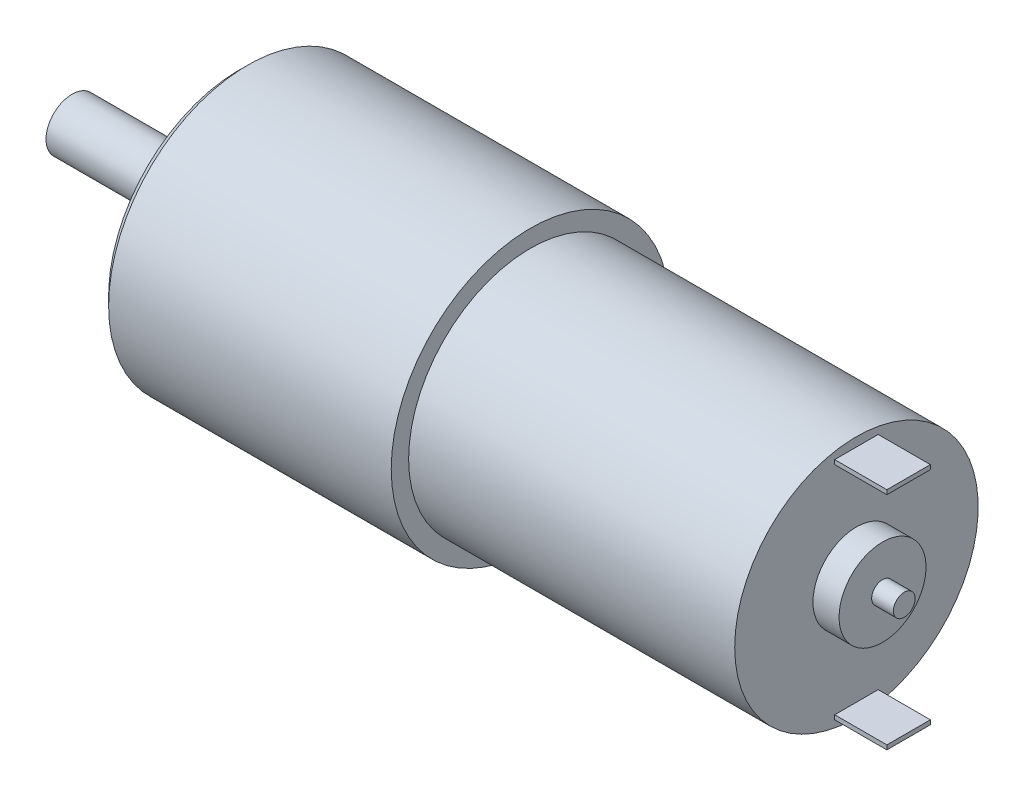
ISO-10303-21;
HEADER;
FILE_DESCRIPTION(('STEP AP214'),'2;1');
FILE_NAME('part.step','',(''),(''),'','','');
FILE_SCHEMA(('AUTOMOTIVE_DESIGN { 1 0 10303 214 1 1 1 1 }'));
ENDSEC;
DATA;
#1=APPLICATION_CONTEXT('core data for automotive mechanical design processes');
#2=APPLICATION_PROTOCOL_DEFINITION('international standard','automotive_design',2000,#1);
#3=PRODUCT_CONTEXT('',#1,'mechanical');
#4=PRODUCT('Part','Part','',(#3));
#5=PRODUCT_RELATED_PRODUCT_CATEGORY('part','',(#4));
#6=PRODUCT_DEFINITION_FORMATION('','',#4);
#7=PRODUCT_DEFINITION_CONTEXT('part definition',#1,'design');
#8=PRODUCT_DEFINITION('design','',#6,#7);
#9=PRODUCT_DEFINITION_SHAPE('','',#8);
#10=(LENGTH_UNIT() NAMED_UNIT(*) SI_UNIT(.MILLI.,.METRE.));
#11=(NAMED_UNIT(*) PLANE_ANGLE_UNIT() SI_UNIT($,.RADIAN.));
#12=(NAMED_UNIT(*) SI_UNIT($,.STERADIAN.) SOLID_ANGLE_UNIT());
#13=UNCERTAINTY_MEASURE_WITH_UNIT(LENGTH_MEASURE(1.E-05),#10,'distance_accuracy_value','');
#14=(GEOMETRIC_REPRESENTATION_CONTEXT(3) GLOBAL_UNCERTAINTY_ASSIGNED_CONTEXT((#13)) GLOBAL_UNIT_ASSIGNED_CONTEXT((#10,
#11,#12)) REPRESENTATION_CONTEXT('',''));
#15=CARTESIAN_POINT('',(0.,0.,0.));
#16=DIRECTION('',(0.,0.,1.));
#17=DIRECTION('',(1.,0.,0.));
#18=AXIS2_PLACEMENT_3D('',#15,#16,#17);
#19=CARTESIAN_POINT('',(90.2,0.,-14.));
#20=DIRECTION('',(-1.,0.,0.));
#21=DIRECTION('',(0.,0.,1.));
#22=AXIS2_PLACEMENT_3D('',#19,#20,#21);
#23=PLANE('',#22);
#24=DIRECTION('',(0.,-1.,0.));
#25=VECTOR('',#24,1.);
#26=CARTESIAN_POINT('',(90.2,12.4569736347008,2.5));
#27=LINE('',#26,#25);
#28=CARTESIAN_POINT('',(90.2,12.9569736347008,2.5));
#29=VERTEX_POINT('',#28);
#30=CARTESIAN_POINT('',(90.2,12.4569736347008,2.5));
#31=VERTEX_POINT('',#30);
#32=EDGE_CURVE('E146',#29,#31,#27,.T.);
#33=ORIENTED_EDGE('',*,*,#32,.F.);
#34=DIRECTION('',(0.,0.,1.));
#35=VECTOR('',#34,1.);
#36=CARTESIAN_POINT('',(90.2,12.9569736347008,0.));
#37=LINE('',#36,#35);
#38=CARTESIAN_POINT('',(90.2,12.9569736347008,-2.5));
#39=VERTEX_POINT('',#38);
#40=EDGE_CURVE('E159',#39,#29,#37,.T.);
#41=ORIENTED_EDGE('',*,*,#40,.F.);
#42=DIRECTION('',(0.,1.,0.));
#43=VECTOR('',#42,1.);
#44=CARTESIAN_POINT('',(90.2,12.9569736347008,-2.5));
#45=LINE('',#44,#43);
#46=CARTESIAN_POINT('',(90.2,12.4569736347008,-2.5));
#47=VERTEX_POINT('',#46);
#48=EDGE_CURVE('E169',#47,#39,#45,.T.);
#49=ORIENTED_EDGE('',*,*,#48,.F.);
#50=DIRECTION('',(0.,0.,-1.));
#51=VECTOR('',#50,1.);
#52=CARTESIAN_POINT('',(90.2,12.4569736347008,2.5));
#53=LINE('',#52,#51);
#54=EDGE_CURVE('E149',#31,#47,#53,.T.);
#55=ORIENTED_EDGE('',*,*,#54,.F.);
#56=EDGE_LOOP('',(#33,#41,#49,#55));
#57=FACE_BOUND('',#56,.T.);
#58=CARTESIAN_POINT('',(90.2,0.,0.));
#59=DIRECTION('',(-1.,0.,0.));
#60=DIRECTION('',(0.,0.,1.));
#61=AXIS2_PLACEMENT_3D('',#58,#59,#60);
#62=CIRCLE('',#61,14.);
#63=CARTESIAN_POINT('',(90.2,0.,14.));
#64=VERTEX_POINT('',#63);
#65=EDGE_CURVE('E242',#64,#64,#62,.T.);
#66=ORIENTED_EDGE('',*,*,#65,.F.);
#67=EDGE_LOOP('',(#66));
#68=FACE_BOUND('',#67,.T.);
#69=CARTESIAN_POINT('',(90.2,0.,0.));
#70=DIRECTION('',(-1.,0.,0.));
#71=DIRECTION('',(0.,0.,1.));
#72=AXIS2_PLACEMENT_3D('',#69,#70,#71);
#73=CIRCLE('',#72,5.);
#74=CARTESIAN_POINT('',(90.2,0.,5.));
#75=VERTEX_POINT('',#74);
#76=EDGE_CURVE('E239',#75,#75,#73,.T.);
#77=ORIENTED_EDGE('',*,*,#76,.T.);
#78=EDGE_LOOP('',(#77));
#79=FACE_BOUND('',#78,.T.);
#80=DIRECTION('',(0.,1.,0.));
#81=VECTOR('',#80,1.);
#82=CARTESIAN_POINT('',(90.2,-12.4569736347008,-2.5));
#83=LINE('',#82,#81);
#84=CARTESIAN_POINT('',(90.2,-12.9569736347008,-2.5));
#85=VERTEX_POINT('',#84);
#86=CARTESIAN_POINT('',(90.2,-12.4569736347008,-2.5));
#87=VERTEX_POINT('',#86);
#88=EDGE_CURVE('E408',#85,#87,#83,.T.);
#89=ORIENTED_EDGE('',*,*,#88,.F.);
#90=DIRECTION('',(0.,0.,-1.));
#91=VECTOR('',#90,1.);
#92=CARTESIAN_POINT('',(90.2,-12.9569736347008,0.));
#93=LINE('',#92,#91);
#94=CARTESIAN_POINT('',(90.2,-12.9569736347008,2.5));
#95=VERTEX_POINT('',#94);
#96=EDGE_CURVE('E142',#95,#85,#93,.T.);
#97=ORIENTED_EDGE('',*,*,#96,.F.);
#98=DIRECTION('',(0.,-1.,0.));
#99=VECTOR('',#98,1.);
#100=CARTESIAN_POINT('',(90.2,-12.9569736347008,2.5));
#101=LINE('',#100,#99);
#102=CARTESIAN_POINT('',(90.2,-12.4569736347008,2.5));
#103=VERTEX_POINT('',#102);
#104=EDGE_CURVE('E56',#103,#95,#101,.T.);
#105=ORIENTED_EDGE('',*,*,#104,.F.);
#106=DIRECTION('',(0.,0.,1.));
#107=VECTOR('',#106,1.);
#108=CARTESIAN_POINT('',(90.2,-12.4569736347008,-2.5));
#109=LINE('',#108,#107);
#110=EDGE_CURVE('E51',#87,#103,#109,.T.);
#111=ORIENTED_EDGE('',*,*,#110,.F.);
#112=EDGE_LOOP('',(#89,#97,#105,#111));
#113=FACE_BOUND('',#112,.T.);
#114=ADVANCED_FACE('F36',(#57,#68,#79,#113),#23,.F.);
#115=CARTESIAN_POINT('',(16.2,0.,-7.));
#116=DIRECTION('',(1.,0.,0.));
#117=DIRECTION('',(0.,0.,-1.));
#118=AXIS2_PLACEMENT_3D('',#115,#116,#117);
#119=PLANE('',#118);
#120=CARTESIAN_POINT('',(16.2,0.,0.));
#121=DIRECTION('',(-1.,0.,0.));
#122=DIRECTION('',(0.,0.,1.));
#123=AXIS2_PLACEMENT_3D('',#120,#121,#122);
#124=CIRCLE('',#123,7.);
#125=CARTESIAN_POINT('',(16.2,0.,7.));
#126=VERTEX_POINT('',#125);
#127=EDGE_CURVE('E259',#126,#126,#124,.T.);
#128=ORIENTED_EDGE('',*,*,#127,.F.);
#129=EDGE_LOOP('',(#128));
#130=FACE_BOUND('',#129,.T.);
#131=DIRECTION('',(0.,0.,1.));
#132=VECTOR('',#131,1.);
#133=CARTESIAN_POINT('',(16.2,-9.,-10.));
#134=LINE('',#133,#132);
#135=CARTESIAN_POINT('',(16.2,-9.,-4.35889894354067));
#136=VERTEX_POINT('',#135);
#137=CARTESIAN_POINT('',(16.2,-9.,4.35889894354067));
#138=VERTEX_POINT('',#137);
#139=EDGE_CURVE('E213',#136,#138,#134,.T.);
#140=ORIENTED_EDGE('',*,*,#139,.T.);
#141=CARTESIAN_POINT('',(16.2,0.,0.));
#142=DIRECTION('',(-1.,0.,0.));
#143=DIRECTION('',(0.,0.,1.));
#144=AXIS2_PLACEMENT_3D('',#141,#142,#143);
#145=CIRCLE('',#144,10.);
#146=CARTESIAN_POINT('',(16.2,9.,4.35889894354067));
#147=VERTEX_POINT('',#146);
#148=EDGE_CURVE('E256',#138,#147,#145,.T.);
#149=ORIENTED_EDGE('',*,*,#148,.T.);
#150=DIRECTION('',(0.,0.,-1.));
#151=VECTOR('',#150,1.);
#152=CARTESIAN_POINT('',(16.2,9.,-10.));
#153=LINE('',#152,#151);
#154=CARTESIAN_POINT('',(16.2,9.,-4.35889894354067));
#155=VERTEX_POINT('',#154);
#156=EDGE_CURVE('E207',#147,#155,#153,.T.);
#157=ORIENTED_EDGE('',*,*,#156,.T.);
#158=EDGE_CURVE('E255',#155,#136,#145,.T.);
#159=ORIENTED_EDGE('',*,*,#158,.T.);
#160=EDGE_LOOP('',(#140,#149,#157,#159));
#161=FACE_BOUND('',#160,.T.);
#162=ADVANCED_FACE('F298',(#130,#161),#119,.F.);
#163=CARTESIAN_POINT('',(0.,0.,0.));
#164=DIRECTION('',(-1.,0.,0.));
#165=DIRECTION('',(0.,0.,1.));
#166=AXIS2_PLACEMENT_3D('',#163,#164,#165);
#167=CYLINDRICAL_SURFACE('',#166,10.);
#168=DIRECTION('',(-1.,0.,0.));
#169=VECTOR('',#168,1.);
#170=CARTESIAN_POINT('',(0.,-9.,4.35889894354067));
#171=LINE('',#170,#169);
#172=CARTESIAN_POINT('',(19.2,-9.,4.35889894354067));
#173=VERTEX_POINT('',#172);
#174=EDGE_CURVE('E227',#173,#138,#171,.T.);
#175=ORIENTED_EDGE('',*,*,#174,.F.);
#176=CARTESIAN_POINT('',(19.2,0.,0.));
#177=DIRECTION('',(-1.,0.,0.));
#178=DIRECTION('',(0.,0.,1.));
#179=AXIS2_PLACEMENT_3D('',#176,#177,#178);
#180=CIRCLE('',#179,10.);
#181=CARTESIAN_POINT('',(19.2,9.,4.35889894354067));
#182=VERTEX_POINT('',#181);
#183=EDGE_CURVE('E252',#173,#182,#180,.T.);
#184=ORIENTED_EDGE('',*,*,#183,.T.);
#185=DIRECTION('',(-1.,0.,0.));
#186=VECTOR('',#185,1.);
#187=CARTESIAN_POINT('',(0.,9.,4.35889894354067));
#188=LINE('',#187,#186);
#189=EDGE_CURVE('E216',#147,#182,#188,.F.);
#190=ORIENTED_EDGE('',*,*,#189,.F.);
#191=ORIENTED_EDGE('',*,*,#148,.F.);
#192=EDGE_LOOP('',(#175,#184,#190,#191));
#193=FACE_BOUND('',#192,.T.);
#194=ADVANCED_FACE('F304',(#193),#167,.T.);
#195=CARTESIAN_POINT('',(19.2,9.,-4.35889894354067));
#196=VERTEX_POINT('',#195);
#197=CARTESIAN_POINT('',(19.2,-9.,-4.35889894354067));
#198=VERTEX_POINT('',#197);
#199=EDGE_CURVE('E251',#196,#198,#180,.T.);
#200=ORIENTED_EDGE('',*,*,#199,.T.);
#201=DIRECTION('',(-1.,0.,0.));
#202=VECTOR('',#201,1.);
#203=CARTESIAN_POINT('',(0.,-9.,-4.35889894354067));
#204=LINE('',#203,#202);
#205=EDGE_CURVE('E224',#136,#198,#204,.F.);
#206=ORIENTED_EDGE('',*,*,#205,.F.);
#207=ORIENTED_EDGE('',*,*,#158,.F.);
#208=DIRECTION('',(-1.,0.,0.));
#209=VECTOR('',#208,1.);
#210=CARTESIAN_POINT('',(0.,9.,-4.35889894354067));
#211=LINE('',#210,#209);
#212=EDGE_CURVE('E222',#196,#155,#211,.T.);
#213=ORIENTED_EDGE('',*,*,#212,.F.);
#214=EDGE_LOOP('',(#200,#206,#207,#213));
#215=FACE_BOUND('',#214,.T.);
#216=ADVANCED_FACE('F329',(#215),#167,.T.);
#217=CARTESIAN_POINT('',(0.,0.,0.));
#218=DIRECTION('',(1.,0.,0.));
#219=DIRECTION('',(0.,0.,-1.));
#220=AXIS2_PLACEMENT_3D('',#217,#218,#219);
#221=PLANE('',#220);
#222=CARTESIAN_POINT('',(0.,0.,0.));
#223=DIRECTION('',(-1.,0.,0.));
#224=DIRECTION('',(0.,0.,1.));
#225=AXIS2_PLACEMENT_3D('',#222,#223,#224);
#226=CIRCLE('',#225,3.);
#227=CARTESIAN_POINT('',(0.,0.,3.));
#228=VERTEX_POINT('',#227);
#229=EDGE_CURVE('E274',#228,#228,#226,.T.);
#230=ORIENTED_EDGE('',*,*,#229,.T.);
#231=EDGE_LOOP('',(#230));
#232=FACE_BOUND('',#231,.T.);
#233=ADVANCED_FACE('F349',(#232),#221,.F.);
#234=CARTESIAN_POINT('',(0.,0.,0.));
#235=DIRECTION('',(-1.,0.,0.));
#236=DIRECTION('',(0.,0.,1.));
#237=AXIS2_PLACEMENT_3D('',#234,#235,#236);
#238=CYLINDRICAL_SURFACE('',#237,3.);
#239=ORIENTED_EDGE('',*,*,#229,.F.);
#240=EDGE_LOOP('',(#239));
#241=FACE_BOUND('',#240,.T.);
#242=CARTESIAN_POINT('',(15.,0.,0.));
#243=DIRECTION('',(-1.,0.,0.));
#244=DIRECTION('',(0.,0.,1.));
#245=AXIS2_PLACEMENT_3D('',#242,#243,#244);
#246=CIRCLE('',#245,3.);
#247=CARTESIAN_POINT('',(15.,0.,3.));
#248=VERTEX_POINT('',#247);
#249=EDGE_CURVE('E271',#248,#248,#246,.T.);
#250=ORIENTED_EDGE('',*,*,#249,.T.);
#251=EDGE_LOOP('',(#250));
#252=FACE_BOUND('',#251,.T.);
#253=ADVANCED_FACE('F346',(#241,#252),#238,.T.);
#254=CARTESIAN_POINT('',(15.,0.,-3.));
#255=DIRECTION('',(1.,0.,0.));
#256=DIRECTION('',(0.,0.,-1.));
#257=AXIS2_PLACEMENT_3D('',#254,#255,#256);
#258=PLANE('',#257);
#259=ORIENTED_EDGE('',*,*,#249,.F.);
#260=EDGE_LOOP('',(#259));
#261=FACE_BOUND('',#260,.T.);
#262=CARTESIAN_POINT('',(15.,0.,0.));
#263=DIRECTION('',(-1.,0.,0.));
#264=DIRECTION('',(0.,0.,1.));
#265=AXIS2_PLACEMENT_3D('',#262,#263,#264);
#266=CIRCLE('',#265,5.5);
#267=CARTESIAN_POINT('',(15.,0.,5.5));
#268=VERTEX_POINT('',#267);
#269=EDGE_CURVE('E268',#268,#268,#266,.T.);
#270=ORIENTED_EDGE('',*,*,#269,.T.);
#271=EDGE_LOOP('',(#270));
#272=FACE_BOUND('',#271,.T.);
#273=ADVANCED_FACE('F342',(#261,#272),#258,.F.);
#274=CARTESIAN_POINT('',(0.,0.,0.));
#275=DIRECTION('',(-1.,0.,0.));
#276=DIRECTION('',(0.,0.,1.));
#277=AXIS2_PLACEMENT_3D('',#274,#275,#276);
#278=CYLINDRICAL_SURFACE('',#277,5.5);
#279=ORIENTED_EDGE('',*,*,#269,.F.);
#280=EDGE_LOOP('',(#279));
#281=FACE_BOUND('',#280,.T.);
#282=CARTESIAN_POINT('',(15.8,0.,0.));
#283=DIRECTION('',(-1.,0.,0.));
#284=DIRECTION('',(0.,0.,1.));
#285=AXIS2_PLACEMENT_3D('',#282,#283,#284);
#286=CIRCLE('',#285,5.5);
#287=CARTESIAN_POINT('',(15.8,0.,5.5));
#288=VERTEX_POINT('',#287);
#289=EDGE_CURVE('E265',#288,#288,#286,.T.);
#290=ORIENTED_EDGE('',*,*,#289,.T.);
#291=EDGE_LOOP('',(#290));
#292=FACE_BOUND('',#291,.T.);
#293=ADVANCED_FACE('F338',(#281,#292),#278,.T.);
#294=CARTESIAN_POINT('',(15.8,0.,-5.5));
#295=DIRECTION('',(1.,0.,0.));
#296=DIRECTION('',(0.,0.,-1.));
#297=AXIS2_PLACEMENT_3D('',#294,#295,#296);
#298=PLANE('',#297);
#299=ORIENTED_EDGE('',*,*,#289,.F.);
#300=EDGE_LOOP('',(#299));
#301=FACE_BOUND('',#300,.T.);
#302=CARTESIAN_POINT('',(15.8,0.,0.));
#303=DIRECTION('',(-1.,0.,0.));
#304=DIRECTION('',(0.,0.,1.));
#305=AXIS2_PLACEMENT_3D('',#302,#303,#304);
#306=CIRCLE('',#305,7.);
#307=CARTESIAN_POINT('',(15.8,0.,7.));
#308=VERTEX_POINT('',#307);
#309=EDGE_CURVE('E262',#308,#308,#306,.T.);
#310=ORIENTED_EDGE('',*,*,#309,.T.);
#311=EDGE_LOOP('',(#310));
#312=FACE_BOUND('',#311,.T.);
#313=ADVANCED_FACE('F334',(#301,#312),#298,.F.);
#314=CARTESIAN_POINT('',(0.,0.,0.));
#315=DIRECTION('',(-1.,0.,0.));
#316=DIRECTION('',(0.,0.,1.));
#317=AXIS2_PLACEMENT_3D('',#314,#315,#316);
#318=CYLINDRICAL_SURFACE('',#317,7.);
#319=ORIENTED_EDGE('',*,*,#309,.F.);
#320=EDGE_LOOP('',(#319));
#321=FACE_BOUND('',#320,.T.);
#322=ORIENTED_EDGE('',*,*,#127,.T.);
#323=EDGE_LOOP('',(#322));
#324=FACE_BOUND('',#323,.T.);
#325=ADVANCED_FACE('F326',(#321,#324),#318,.T.);
#326=CARTESIAN_POINT('',(19.2,0.,-10.));
#327=DIRECTION('',(1.,0.,0.));
#328=DIRECTION('',(0.,0.,-1.));
#329=AXIS2_PLACEMENT_3D('',#326,#327,#328);
#330=PLANE('',#329);
#331=CARTESIAN_POINT('',(19.2,9.19238815542504,-9.1923881554252));
#332=DIRECTION('',(-1.,0.,0.));
#333=DIRECTION('',(0.,-1.,0.));
#334=AXIS2_PLACEMENT_3D('',#331,#332,#333);
#335=CIRCLE('',#334,1.5);
#336=CARTESIAN_POINT('',(19.2,7.69238815542504,-9.19238815542519));
#337=VERTEX_POINT('',#336);
#338=EDGE_CURVE('E185',#337,#337,#335,.T.);
#339=ORIENTED_EDGE('',*,*,#338,.F.);
#340=EDGE_LOOP('',(#339));
#341=FACE_BOUND('',#340,.T.);
#342=CARTESIAN_POINT('',(19.2,9.19238815542511,9.19238815542513));
#343=DIRECTION('',(-1.,0.,0.));
#344=DIRECTION('',(0.,0.,-1.));
#345=AXIS2_PLACEMENT_3D('',#342,#343,#344);
#346=CIRCLE('',#345,1.5);
#347=CARTESIAN_POINT('',(19.2,9.19238815542511,7.69238815542513));
#348=VERTEX_POINT('',#347);
#349=EDGE_CURVE('E189',#348,#348,#346,.T.);
#350=ORIENTED_EDGE('',*,*,#349,.F.);
#351=EDGE_LOOP('',(#350));
#352=FACE_BOUND('',#351,.T.);
#353=CARTESIAN_POINT('',(19.2,-9.1923881554251,9.19238815542514));
#354=DIRECTION('',(-1.,0.,0.));
#355=DIRECTION('',(0.,1.,0.));
#356=AXIS2_PLACEMENT_3D('',#353,#354,#355);
#357=CIRCLE('',#356,1.5);
#358=CARTESIAN_POINT('',(19.2,-7.6923881554251,9.19238815542513));
#359=VERTEX_POINT('',#358);
#360=EDGE_CURVE('E195',#359,#359,#357,.T.);
#361=ORIENTED_EDGE('',*,*,#360,.F.);
#362=EDGE_LOOP('',(#361));
#363=FACE_BOUND('',#362,.T.);
#364=CARTESIAN_POINT('',(19.2,-9.19238815542511,-9.19238815542513));
#365=DIRECTION('',(-1.,0.,0.));
#366=DIRECTION('',(0.,0.,1.));
#367=AXIS2_PLACEMENT_3D('',#364,#365,#366);
#368=CIRCLE('',#367,1.5);
#369=CARTESIAN_POINT('',(19.2,-9.19238815542511,-7.69238815542513));
#370=VERTEX_POINT('',#369);
#371=EDGE_CURVE('E201',#370,#370,#368,.T.);
#372=ORIENTED_EDGE('',*,*,#371,.F.);
#373=EDGE_LOOP('',(#372));
#374=FACE_BOUND('',#373,.T.);
#375=CARTESIAN_POINT('',(19.2,0.,0.));
#376=DIRECTION('',(1.,0.,0.));
#377=DIRECTION('',(0.,0.,-1.));
#378=AXIS2_PLACEMENT_3D('',#375,#376,#377);
#379=CIRCLE('',#378,15.);
#380=CARTESIAN_POINT('',(19.2,0.,-15.));
#381=VERTEX_POINT('',#380);
#382=EDGE_CURVE('E44',#381,#381,#379,.F.);
#383=ORIENTED_EDGE('',*,*,#382,.T.);
#384=EDGE_LOOP('',(#383));
#385=FACE_BOUND('',#384,.T.);
#386=ORIENTED_EDGE('',*,*,#183,.F.);
#387=DIRECTION('',(0.,0.,1.));
#388=VECTOR('',#387,1.);
#389=CARTESIAN_POINT('',(19.2,-9.,-10.));
#390=LINE('',#389,#388);
#391=EDGE_CURVE('E212',#198,#173,#390,.T.);
#392=ORIENTED_EDGE('',*,*,#391,.F.);
#393=ORIENTED_EDGE('',*,*,#199,.F.);
#394=DIRECTION('',(0.,0.,-1.));
#395=VECTOR('',#394,1.);
#396=CARTESIAN_POINT('',(19.2,9.,-10.));
#397=LINE('',#396,#395);
#398=EDGE_CURVE('E210',#182,#196,#397,.T.);
#399=ORIENTED_EDGE('',*,*,#398,.F.);
#400=EDGE_LOOP('',(#386,#392,#393,#399));
#401=FACE_BOUND('',#400,.T.);
#402=ADVANCED_FACE('F279',(#341,#352,#363,#374,#385,#401),#330,.F.);
#403=CARTESIAN_POINT('',(0.,0.,0.));
#404=DIRECTION('',(-1.,0.,0.));
#405=DIRECTION('',(0.,0.,1.));
#406=AXIS2_PLACEMENT_3D('',#403,#404,#405);
#407=CYLINDRICAL_SURFACE('',#406,16.);
#408=CARTESIAN_POINT('',(20.2,0.,0.));
#409=DIRECTION('',(1.,0.,0.));
#410=DIRECTION('',(0.,0.,-1.));
#411=AXIS2_PLACEMENT_3D('',#408,#409,#410);
#412=CIRCLE('',#411,16.);
#413=CARTESIAN_POINT('',(20.2,0.,-16.));
#414=VERTEX_POINT('',#413);
#415=EDGE_CURVE('E12',#414,#414,#412,.T.);
#416=ORIENTED_EDGE('',*,*,#415,.T.);
#417=EDGE_LOOP('',(#416));
#418=FACE_BOUND('',#417,.T.);
#419=CARTESIAN_POINT('',(52.7,0.,0.));
#420=DIRECTION('',(-1.,0.,0.));
#421=DIRECTION('',(0.,0.,1.));
#422=AXIS2_PLACEMENT_3D('',#419,#420,#421);
#423=CIRCLE('',#422,16.);
#424=CARTESIAN_POINT('',(52.7,0.,16.));
#425=VERTEX_POINT('',#424);
#426=EDGE_CURVE('E248',#425,#425,#423,.T.);
#427=ORIENTED_EDGE('',*,*,#426,.T.);
#428=EDGE_LOOP('',(#427));
#429=FACE_BOUND('',#428,.T.);
#430=ADVANCED_FACE('F319',(#418,#429),#407,.T.);
#431=CARTESIAN_POINT('',(52.7,0.,-16.));
#432=DIRECTION('',(-1.,0.,0.));
#433=DIRECTION('',(0.,0.,1.));
#434=AXIS2_PLACEMENT_3D('',#431,#432,#433);
#435=PLANE('',#434);
#436=ORIENTED_EDGE('',*,*,#426,.F.);
#437=EDGE_LOOP('',(#436));
#438=FACE_BOUND('',#437,.T.);
#439=CARTESIAN_POINT('',(52.7,0.,0.));
#440=DIRECTION('',(-1.,0.,0.));
#441=DIRECTION('',(0.,0.,1.));
#442=AXIS2_PLACEMENT_3D('',#439,#440,#441);
#443=CIRCLE('',#442,14.);
#444=CARTESIAN_POINT('',(52.7,0.,14.));
#445=VERTEX_POINT('',#444);
#446=EDGE_CURVE('E245',#445,#445,#443,.T.);
#447=ORIENTED_EDGE('',*,*,#446,.T.);
#448=EDGE_LOOP('',(#447));
#449=FACE_BOUND('',#448,.T.);
#450=ADVANCED_FACE('F315',(#438,#449),#435,.F.);
#451=CARTESIAN_POINT('',(0.,0.,0.));
#452=DIRECTION('',(-1.,0.,0.));
#453=DIRECTION('',(0.,0.,1.));
#454=AXIS2_PLACEMENT_3D('',#451,#452,#453);
#455=CYLINDRICAL_SURFACE('',#454,14.);
#456=ORIENTED_EDGE('',*,*,#446,.F.);
#457=EDGE_LOOP('',(#456));
#458=FACE_BOUND('',#457,.T.);
#459=ORIENTED_EDGE('',*,*,#65,.T.);
#460=EDGE_LOOP('',(#459));
#461=FACE_BOUND('',#460,.T.);
#462=ADVANCED_FACE('F312',(#458,#461),#455,.T.);
#463=CARTESIAN_POINT('',(0.,0.,0.));
#464=DIRECTION('',(-1.,0.,0.));
#465=DIRECTION('',(0.,0.,1.));
#466=AXIS2_PLACEMENT_3D('',#463,#464,#465);
#467=CYLINDRICAL_SURFACE('',#466,5.);
#468=ORIENTED_EDGE('',*,*,#76,.F.);
#469=EDGE_LOOP('',(#468));
#470=FACE_BOUND('',#469,.T.);
#471=CARTESIAN_POINT('',(93.2,0.,0.));
#472=DIRECTION('',(-1.,0.,0.));
#473=DIRECTION('',(0.,0.,1.));
#474=AXIS2_PLACEMENT_3D('',#471,#472,#473);
#475=CIRCLE('',#474,5.);
#476=CARTESIAN_POINT('',(93.2,0.,5.));
#477=VERTEX_POINT('',#476);
#478=EDGE_CURVE('E236',#477,#477,#475,.T.);
#479=ORIENTED_EDGE('',*,*,#478,.T.);
#480=EDGE_LOOP('',(#479));
#481=FACE_BOUND('',#480,.T.);
#482=ADVANCED_FACE('F310',(#470,#481),#467,.T.);
#483=CARTESIAN_POINT('',(93.2,0.,-5.));
#484=DIRECTION('',(-1.,0.,0.));
#485=DIRECTION('',(0.,0.,1.));
#486=AXIS2_PLACEMENT_3D('',#483,#484,#485);
#487=PLANE('',#486);
#488=ORIENTED_EDGE('',*,*,#478,.F.);
#489=EDGE_LOOP('',(#488));
#490=FACE_BOUND('',#489,.T.);
#491=CARTESIAN_POINT('',(93.2,0.,0.));
#492=DIRECTION('',(-1.,0.,0.));
#493=DIRECTION('',(0.,0.,1.));
#494=AXIS2_PLACEMENT_3D('',#491,#492,#493);
#495=CIRCLE('',#494,1.25);
#496=CARTESIAN_POINT('',(93.2,0.,1.25));
#497=VERTEX_POINT('',#496);
#498=EDGE_CURVE('E233',#497,#497,#495,.T.);
#499=ORIENTED_EDGE('',*,*,#498,.T.);
#500=EDGE_LOOP('',(#499));
#501=FACE_BOUND('',#500,.T.);
#502=ADVANCED_FACE('F390',(#490,#501),#487,.F.);
#503=CARTESIAN_POINT('',(0.,0.,0.));
#504=DIRECTION('',(-1.,0.,0.));
#505=DIRECTION('',(0.,0.,1.));
#506=AXIS2_PLACEMENT_3D('',#503,#504,#505);
#507=CYLINDRICAL_SURFACE('',#506,1.25);
#508=ORIENTED_EDGE('',*,*,#498,.F.);
#509=EDGE_LOOP('',(#508));
#510=FACE_BOUND('',#509,.T.);
#511=CARTESIAN_POINT('',(95.7,0.,0.));
#512=DIRECTION('',(-1.,0.,0.));
#513=DIRECTION('',(0.,0.,1.));
#514=AXIS2_PLACEMENT_3D('',#511,#512,#513);
#515=CIRCLE('',#514,1.25);
#516=CARTESIAN_POINT('',(95.7,0.,1.25));
#517=VERTEX_POINT('',#516);
#518=EDGE_CURVE('E230',#517,#517,#515,.T.);
#519=ORIENTED_EDGE('',*,*,#518,.T.);
#520=EDGE_LOOP('',(#519));
#521=FACE_BOUND('',#520,.T.);
#522=ADVANCED_FACE('F385',(#510,#521),#507,.T.);
#523=CARTESIAN_POINT('',(95.7,0.,-1.25));
#524=DIRECTION('',(-1.,0.,0.));
#525=DIRECTION('',(0.,0.,1.));
#526=AXIS2_PLACEMENT_3D('',#523,#524,#525);
#527=PLANE('',#526);
#528=ORIENTED_EDGE('',*,*,#518,.F.);
#529=EDGE_LOOP('',(#528));
#530=FACE_BOUND('',#529,.T.);
#531=ADVANCED_FACE('F380',(#530),#527,.F.);
#532=CARTESIAN_POINT('',(19.2,9.,-10.));
#533=DIRECTION('',(0.,1.,0.));
#534=DIRECTION('',(0.,0.,1.));
#535=AXIS2_PLACEMENT_3D('',#532,#533,#534);
#536=PLANE('',#535);
#537=ORIENTED_EDGE('',*,*,#212,.T.);
#538=ORIENTED_EDGE('',*,*,#156,.F.);
#539=ORIENTED_EDGE('',*,*,#189,.T.);
#540=ORIENTED_EDGE('',*,*,#398,.T.);
#541=EDGE_LOOP('',(#537,#538,#539,#540));
#542=FACE_BOUND('',#541,.T.);
#543=ADVANCED_FACE('F293',(#542),#536,.T.);
#544=CARTESIAN_POINT('',(19.2,-9.,-10.));
#545=DIRECTION('',(0.,-1.,0.));
#546=DIRECTION('',(0.,0.,-1.));
#547=AXIS2_PLACEMENT_3D('',#544,#545,#546);
#548=PLANE('',#547);
#549=ORIENTED_EDGE('',*,*,#174,.T.);
#550=ORIENTED_EDGE('',*,*,#139,.F.);
#551=ORIENTED_EDGE('',*,*,#205,.T.);
#552=ORIENTED_EDGE('',*,*,#391,.T.);
#553=EDGE_LOOP('',(#549,#550,#551,#552));
#554=FACE_BOUND('',#553,.T.);
#555=ADVANCED_FACE('F284',(#554),#548,.T.);
#556=CARTESIAN_POINT('',(19.2,0.,0.));
#557=DIRECTION('',(1.,0.,0.));
#558=DIRECTION('',(0.,0.,-1.));
#559=AXIS2_PLACEMENT_3D('',#556,#557,#558);
#560=CONICAL_SURFACE('',#559,15.,0.785398163397441);
#561=ORIENTED_EDGE('',*,*,#415,.F.);
#562=EDGE_LOOP('',(#561));
#563=FACE_BOUND('',#562,.T.);
#564=ORIENTED_EDGE('',*,*,#382,.F.);
#565=EDGE_LOOP('',(#564));
#566=FACE_BOUND('',#565,.T.);
#567=ADVANCED_FACE('F38',(#563,#566),#560,.T.);
#568=CARTESIAN_POINT('',(22.2,-9.19238815542511,-9.19238815542513));
#569=DIRECTION('',(-1.,0.,0.));
#570=DIRECTION('',(0.,0.,1.));
#571=AXIS2_PLACEMENT_3D('',#568,#569,#570);
#572=CYLINDRICAL_SURFACE('',#571,1.5);
#573=CARTESIAN_POINT('',(22.2,-9.19238815542511,-9.19238815542513));
#574=DIRECTION('',(-1.,0.,0.));
#575=DIRECTION('',(0.,0.,1.));
#576=AXIS2_PLACEMENT_3D('',#573,#574,#575);
#577=CIRCLE('',#576,1.5);
#578=CARTESIAN_POINT('',(22.2,-9.19238815542511,-7.69238815542513));
#579=VERTEX_POINT('',#578);
#580=EDGE_CURVE('E204',#579,#579,#577,.T.);
#581=ORIENTED_EDGE('',*,*,#580,.F.);
#582=EDGE_LOOP('',(#581));
#583=FACE_BOUND('',#582,.T.);
#584=ORIENTED_EDGE('',*,*,#371,.T.);
#585=EDGE_LOOP('',(#584));
#586=FACE_BOUND('',#585,.T.);
#587=ADVANCED_FACE('F283',(#583,#586),#572,.F.);
#588=CARTESIAN_POINT('',(22.2,-9.19238815542511,-9.19238815542513));
#589=DIRECTION('',(-1.,0.,0.));
#590=DIRECTION('',(0.,0.,1.));
#591=AXIS2_PLACEMENT_3D('',#588,#589,#590);
#592=PLANE('',#591);
#593=ORIENTED_EDGE('',*,*,#580,.T.);
#594=EDGE_LOOP('',(#593));
#595=FACE_BOUND('',#594,.T.);
#596=ADVANCED_FACE('F290',(#595),#592,.T.);
#597=CARTESIAN_POINT('',(22.2,-9.1923881554251,9.19238815542514));
#598=DIRECTION('',(-1.,0.,0.));
#599=DIRECTION('',(0.,0.,1.));
#600=AXIS2_PLACEMENT_3D('',#597,#598,#599);
#601=CYLINDRICAL_SURFACE('',#600,1.5);
#602=CARTESIAN_POINT('',(22.2,-9.1923881554251,9.19238815542514));
#603=DIRECTION('',(-1.,0.,0.));
#604=DIRECTION('',(0.,1.,0.));
#605=AXIS2_PLACEMENT_3D('',#602,#603,#604);
#606=CIRCLE('',#605,1.5);
#607=CARTESIAN_POINT('',(22.2,-7.6923881554251,9.19238815542513));
#608=VERTEX_POINT('',#607);
#609=EDGE_CURVE('E198',#608,#608,#606,.T.);
#610=ORIENTED_EDGE('',*,*,#609,.F.);
#611=EDGE_LOOP('',(#610));
#612=FACE_BOUND('',#611,.T.);
#613=ORIENTED_EDGE('',*,*,#360,.T.);
#614=EDGE_LOOP('',(#613));
#615=FACE_BOUND('',#614,.T.);
#616=ADVANCED_FACE('F472',(#612,#615),#601,.F.);
#617=CARTESIAN_POINT('',(22.2,-9.1923881554251,9.19238815542514));
#618=DIRECTION('',(-1.,0.,0.));
#619=DIRECTION('',(0.,1.,0.));
#620=AXIS2_PLACEMENT_3D('',#617,#618,#619);
#621=PLANE('',#620);
#622=ORIENTED_EDGE('',*,*,#609,.T.);
#623=EDGE_LOOP('',(#622));
#624=FACE_BOUND('',#623,.T.);
#625=ADVANCED_FACE('F468',(#624),#621,.T.);
#626=CARTESIAN_POINT('',(22.2,9.19238815542511,9.19238815542513));
#627=DIRECTION('',(-1.,0.,0.));
#628=DIRECTION('',(0.,0.,1.));
#629=AXIS2_PLACEMENT_3D('',#626,#627,#628);
#630=CYLINDRICAL_SURFACE('',#629,1.5);
#631=CARTESIAN_POINT('',(22.2,9.19238815542511,9.19238815542513));
#632=DIRECTION('',(-1.,0.,0.));
#633=DIRECTION('',(0.,0.,-1.));
#634=AXIS2_PLACEMENT_3D('',#631,#632,#633);
#635=CIRCLE('',#634,1.5);
#636=CARTESIAN_POINT('',(22.2,9.19238815542511,7.69238815542513));
#637=VERTEX_POINT('',#636);
#638=EDGE_CURVE('E192',#637,#637,#635,.T.);
#639=ORIENTED_EDGE('',*,*,#638,.F.);
#640=EDGE_LOOP('',(#639));
#641=FACE_BOUND('',#640,.T.);
#642=ORIENTED_EDGE('',*,*,#349,.T.);
#643=EDGE_LOOP('',(#642));
#644=FACE_BOUND('',#643,.T.);
#645=ADVANCED_FACE('F464',(#641,#644),#630,.F.);
#646=CARTESIAN_POINT('',(22.2,9.19238815542511,9.19238815542513));
#647=DIRECTION('',(-1.,0.,0.));
#648=DIRECTION('',(0.,0.,-1.));
#649=AXIS2_PLACEMENT_3D('',#646,#647,#648);
#650=PLANE('',#649);
#651=ORIENTED_EDGE('',*,*,#638,.T.);
#652=EDGE_LOOP('',(#651));
#653=FACE_BOUND('',#652,.T.);
#654=ADVANCED_FACE('F460',(#653),#650,.T.);
#655=CARTESIAN_POINT('',(22.2,9.19238815542504,-9.1923881554252));
#656=DIRECTION('',(-1.,0.,0.));
#657=DIRECTION('',(0.,0.,1.));
#658=AXIS2_PLACEMENT_3D('',#655,#656,#657);
#659=CYLINDRICAL_SURFACE('',#658,1.5);
#660=CARTESIAN_POINT('',(22.2,9.19238815542504,-9.1923881554252));
#661=DIRECTION('',(-1.,0.,0.));
#662=DIRECTION('',(0.,-1.,0.));
#663=AXIS2_PLACEMENT_3D('',#660,#661,#662);
#664=CIRCLE('',#663,1.5);
#665=CARTESIAN_POINT('',(22.2,7.69238815542504,-9.19238815542519));
#666=VERTEX_POINT('',#665);
#667=EDGE_CURVE('E186',#666,#666,#664,.T.);
#668=ORIENTED_EDGE('',*,*,#667,.F.);
#669=EDGE_LOOP('',(#668));
#670=FACE_BOUND('',#669,.T.);
#671=ORIENTED_EDGE('',*,*,#338,.T.);
#672=EDGE_LOOP('',(#671));
#673=FACE_BOUND('',#672,.T.);
#674=ADVANCED_FACE('F456',(#670,#673),#659,.F.);
#675=CARTESIAN_POINT('',(22.2,9.19238815542504,-9.1923881554252));
#676=DIRECTION('',(-1.,0.,0.));
#677=DIRECTION('',(0.,-1.,0.));
#678=AXIS2_PLACEMENT_3D('',#675,#676,#677);
#679=PLANE('',#678);
#680=ORIENTED_EDGE('',*,*,#667,.T.);
#681=EDGE_LOOP('',(#680));
#682=FACE_BOUND('',#681,.T.);
#683=ADVANCED_FACE('F452',(#682),#679,.T.);
#684=CARTESIAN_POINT('',(96.2,12.4569736347008,2.5));
#685=DIRECTION('',(0.,0.,-1.));
#686=DIRECTION('',(-1.,0.,0.));
#687=AXIS2_PLACEMENT_3D('',#684,#685,#686);
#688=PLANE('',#687);
#689=ORIENTED_EDGE('',*,*,#32,.T.);
#690=DIRECTION('',(-1.,0.,0.));
#691=VECTOR('',#690,1.);
#692=CARTESIAN_POINT('',(96.2,12.4569736347008,2.5));
#693=LINE('',#692,#691);
#694=CARTESIAN_POINT('',(96.2,12.4569736347008,2.5));
#695=VERTEX_POINT('',#694);
#696=EDGE_CURVE('E179',#695,#31,#693,.T.);
#697=ORIENTED_EDGE('',*,*,#696,.F.);
#698=DIRECTION('',(0.,-1.,0.));
#699=VECTOR('',#698,1.);
#700=CARTESIAN_POINT('',(96.2,12.4569736347008,2.5));
#701=LINE('',#700,#699);
#702=CARTESIAN_POINT('',(96.2,12.9569736347008,2.5));
#703=VERTEX_POINT('',#702);
#704=EDGE_CURVE('E158',#703,#695,#701,.T.);
#705=ORIENTED_EDGE('',*,*,#704,.F.);
#706=DIRECTION('',(-1.,0.,0.));
#707=VECTOR('',#706,1.);
#708=CARTESIAN_POINT('',(96.2,12.9569736347008,2.5));
#709=LINE('',#708,#707);
#710=EDGE_CURVE('E182',#703,#29,#709,.T.);
#711=ORIENTED_EDGE('',*,*,#710,.T.);
#712=EDGE_LOOP('',(#689,#697,#705,#711));
#713=FACE_BOUND('',#712,.T.);
#714=ADVANCED_FACE('F448',(#713),#688,.F.);
#715=CARTESIAN_POINT('',(96.2,12.4569736347008,2.5));
#716=DIRECTION('',(0.,1.,0.));
#717=DIRECTION('',(0.,0.,1.));
#718=AXIS2_PLACEMENT_3D('',#715,#716,#717);
#719=PLANE('',#718);
#720=ORIENTED_EDGE('',*,*,#54,.T.);
#721=DIRECTION('',(-1.,0.,0.));
#722=VECTOR('',#721,1.);
#723=CARTESIAN_POINT('',(96.2,12.4569736347008,-2.5));
#724=LINE('',#723,#722);
#725=CARTESIAN_POINT('',(96.2,12.4569736347008,-2.5));
#726=VERTEX_POINT('',#725);
#727=EDGE_CURVE('E176',#726,#47,#724,.T.);
#728=ORIENTED_EDGE('',*,*,#727,.F.);
#729=DIRECTION('',(0.,0.,-1.));
#730=VECTOR('',#729,1.);
#731=CARTESIAN_POINT('',(96.2,12.4569736347008,2.5));
#732=LINE('',#731,#730);
#733=EDGE_CURVE('E161',#695,#726,#732,.T.);
#734=ORIENTED_EDGE('',*,*,#733,.F.);
#735=ORIENTED_EDGE('',*,*,#696,.T.);
#736=EDGE_LOOP('',(#720,#728,#734,#735));
#737=FACE_BOUND('',#736,.T.);
#738=ADVANCED_FACE('F444',(#737),#719,.F.);
#739=CARTESIAN_POINT('',(96.2,12.9569736347008,-2.5));
#740=DIRECTION('',(0.,0.,1.));
#741=DIRECTION('',(0.,-1.,0.));
#742=AXIS2_PLACEMENT_3D('',#739,#740,#741);
#743=PLANE('',#742);
#744=ORIENTED_EDGE('',*,*,#48,.T.);
#745=DIRECTION('',(-1.,0.,0.));
#746=VECTOR('',#745,1.);
#747=CARTESIAN_POINT('',(96.2,12.9569736347008,-2.5));
#748=LINE('',#747,#746);
#749=CARTESIAN_POINT('',(96.2,12.9569736347008,-2.5));
#750=VERTEX_POINT('',#749);
#751=EDGE_CURVE('E165',#750,#39,#748,.T.);
#752=ORIENTED_EDGE('',*,*,#751,.F.);
#753=DIRECTION('',(0.,1.,0.));
#754=VECTOR('',#753,1.);
#755=CARTESIAN_POINT('',(96.2,12.9569736347008,-2.5));
#756=LINE('',#755,#754);
#757=EDGE_CURVE('E163',#726,#750,#756,.T.);
#758=ORIENTED_EDGE('',*,*,#757,.F.);
#759=ORIENTED_EDGE('',*,*,#727,.T.);
#760=EDGE_LOOP('',(#744,#752,#758,#759));
#761=FACE_BOUND('',#760,.T.);
#762=ADVANCED_FACE('F440',(#761),#743,.F.);
#763=CARTESIAN_POINT('',(96.2,12.9569736347008,0.));
#764=DIRECTION('',(0.,-1.,0.));
#765=DIRECTION('',(0.,0.,-1.));
#766=AXIS2_PLACEMENT_3D('',#763,#764,#765);
#767=PLANE('',#766);
#768=ORIENTED_EDGE('',*,*,#40,.T.);
#769=ORIENTED_EDGE('',*,*,#710,.F.);
#770=DIRECTION('',(0.,0.,1.));
#771=VECTOR('',#770,1.);
#772=CARTESIAN_POINT('',(96.2,12.9569736347008,2.5));
#773=LINE('',#772,#771);
#774=EDGE_CURVE('E155',#750,#703,#773,.T.);
#775=ORIENTED_EDGE('',*,*,#774,.F.);
#776=ORIENTED_EDGE('',*,*,#751,.T.);
#777=EDGE_LOOP('',(#768,#769,#775,#776));
#778=FACE_BOUND('',#777,.T.);
#779=ADVANCED_FACE('F436',(#778),#767,.F.);
#780=CARTESIAN_POINT('',(96.2,12.9569736347008,-2.5));
#781=DIRECTION('',(-1.,0.,0.));
#782=DIRECTION('',(0.,0.,1.));
#783=AXIS2_PLACEMENT_3D('',#780,#781,#782);
#784=PLANE('',#783);
#785=ORIENTED_EDGE('',*,*,#774,.T.);
#786=ORIENTED_EDGE('',*,*,#704,.T.);
#787=ORIENTED_EDGE('',*,*,#733,.T.);
#788=ORIENTED_EDGE('',*,*,#757,.T.);
#789=EDGE_LOOP('',(#785,#786,#787,#788));
#790=FACE_BOUND('',#789,.T.);
#791=ADVANCED_FACE('F430',(#790),#784,.F.);
#792=CARTESIAN_POINT('',(96.2,-12.4569736347008,-2.5));
#793=DIRECTION('',(0.,0.,1.));
#794=DIRECTION('',(1.,0.,0.));
#795=AXIS2_PLACEMENT_3D('',#792,#793,#794);
#796=PLANE('',#795);
#797=ORIENTED_EDGE('',*,*,#88,.T.);
#798=DIRECTION('',(-1.,0.,0.));
#799=VECTOR('',#798,1.);
#800=CARTESIAN_POINT('',(96.2,-12.4569736347008,-2.5));
#801=LINE('',#800,#799);
#802=CARTESIAN_POINT('',(96.2,-12.4569736347008,-2.5));
#803=VERTEX_POINT('',#802);
#804=EDGE_CURVE('E129',#803,#87,#801,.T.);
#805=ORIENTED_EDGE('',*,*,#804,.F.);
#806=DIRECTION('',(0.,1.,0.));
#807=VECTOR('',#806,1.);
#808=CARTESIAN_POINT('',(96.2,-12.4569736347008,-2.5));
#809=LINE('',#808,#807);
#810=CARTESIAN_POINT('',(96.2,-12.9569736347008,-2.5));
#811=VERTEX_POINT('',#810);
#812=EDGE_CURVE('E123',#811,#803,#809,.T.);
#813=ORIENTED_EDGE('',*,*,#812,.F.);
#814=DIRECTION('',(-1.,0.,0.));
#815=VECTOR('',#814,1.);
#816=CARTESIAN_POINT('',(96.2,-12.9569736347008,-2.5));
#817=LINE('',#816,#815);
#818=EDGE_CURVE('E127',#811,#85,#817,.T.);
#819=ORIENTED_EDGE('',*,*,#818,.T.);
#820=EDGE_LOOP('',(#797,#805,#813,#819));
#821=FACE_BOUND('',#820,.T.);
#822=ADVANCED_FACE('F125',(#821),#796,.F.);
#823=CARTESIAN_POINT('',(96.2,-12.4569736347008,-2.5));
#824=DIRECTION('',(0.,-1.,0.));
#825=DIRECTION('',(0.,0.,-1.));
#826=AXIS2_PLACEMENT_3D('',#823,#824,#825);
#827=PLANE('',#826);
#828=ORIENTED_EDGE('',*,*,#110,.T.);
#829=DIRECTION('',(-1.,0.,0.));
#830=VECTOR('',#829,1.);
#831=CARTESIAN_POINT('',(96.2,-12.4569736347008,2.5));
#832=LINE('',#831,#830);
#833=CARTESIAN_POINT('',(96.2,-12.4569736347008,2.5));
#834=VERTEX_POINT('',#833);
#835=EDGE_CURVE('E151',#834,#103,#832,.T.);
#836=ORIENTED_EDGE('',*,*,#835,.F.);
#837=DIRECTION('',(0.,0.,1.));
#838=VECTOR('',#837,1.);
#839=CARTESIAN_POINT('',(96.2,-12.4569736347008,-2.5));
#840=LINE('',#839,#838);
#841=EDGE_CURVE('E132',#803,#834,#840,.T.);
#842=ORIENTED_EDGE('',*,*,#841,.F.);
#843=ORIENTED_EDGE('',*,*,#804,.T.);
#844=EDGE_LOOP('',(#828,#836,#842,#843));
#845=FACE_BOUND('',#844,.T.);
#846=ADVANCED_FACE('F422',(#845),#827,.F.);
#847=CARTESIAN_POINT('',(96.2,-12.9569736347008,2.5));
#848=DIRECTION('',(0.,0.,-1.));
#849=DIRECTION('',(0.,1.,0.));
#850=AXIS2_PLACEMENT_3D('',#847,#848,#849);
#851=PLANE('',#850);
#852=ORIENTED_EDGE('',*,*,#104,.T.);
#853=DIRECTION('',(-1.,0.,0.));
#854=VECTOR('',#853,1.);
#855=CARTESIAN_POINT('',(96.2,-12.9569736347008,2.5));
#856=LINE('',#855,#854);
#857=CARTESIAN_POINT('',(96.2,-12.9569736347008,2.5));
#858=VERTEX_POINT('',#857);
#859=EDGE_CURVE('E416',#858,#95,#856,.T.);
#860=ORIENTED_EDGE('',*,*,#859,.F.);
#861=DIRECTION('',(0.,-1.,0.));
#862=VECTOR('',#861,1.);
#863=CARTESIAN_POINT('',(96.2,-12.9569736347008,2.5));
#864=LINE('',#863,#862);
#865=EDGE_CURVE('E138',#834,#858,#864,.T.);
#866=ORIENTED_EDGE('',*,*,#865,.F.);
#867=ORIENTED_EDGE('',*,*,#835,.T.);
#868=EDGE_LOOP('',(#852,#860,#866,#867));
#869=FACE_BOUND('',#868,.T.);
#870=ADVANCED_FACE('F420',(#869),#851,.F.);
#871=CARTESIAN_POINT('',(96.2,-12.9569736347008,0.));
#872=DIRECTION('',(0.,1.,0.));
#873=DIRECTION('',(0.,0.,1.));
#874=AXIS2_PLACEMENT_3D('',#871,#872,#873);
#875=PLANE('',#874);
#876=ORIENTED_EDGE('',*,*,#96,.T.);
#877=ORIENTED_EDGE('',*,*,#818,.F.);
#878=DIRECTION('',(0.,0.,-1.));
#879=VECTOR('',#878,1.);
#880=CARTESIAN_POINT('',(96.2,-12.9569736347008,-2.5));
#881=LINE('',#880,#879);
#882=EDGE_CURVE('E133',#858,#811,#881,.T.);
#883=ORIENTED_EDGE('',*,*,#882,.F.);
#884=ORIENTED_EDGE('',*,*,#859,.T.);
#885=EDGE_LOOP('',(#876,#877,#883,#884));
#886=FACE_BOUND('',#885,.T.);
#887=ADVANCED_FACE('F145',(#886),#875,.F.);
#888=CARTESIAN_POINT('',(96.2,-12.9569736347008,2.5));
#889=DIRECTION('',(-1.,0.,0.));
#890=DIRECTION('',(0.,0.,-1.));
#891=AXIS2_PLACEMENT_3D('',#888,#889,#890);
#892=PLANE('',#891);
#893=ORIENTED_EDGE('',*,*,#882,.T.);
#894=ORIENTED_EDGE('',*,*,#812,.T.);
#895=ORIENTED_EDGE('',*,*,#841,.T.);
#896=ORIENTED_EDGE('',*,*,#865,.T.);
#897=EDGE_LOOP('',(#893,#894,#895,#896));
#898=FACE_BOUND('',#897,.T.);
#899=ADVANCED_FACE('F136',(#898),#892,.F.);
#900=CLOSED_SHELL('',(#114,#162,#194,#216,#233,#253,#273,#293,#313,#325,#402,#430,#450,#462,
#482,#502,#522,#531,#543,#555,#567,#587,#596,#616,#625,#645,#654,#674,#683,#714,#738,#762,#779,
#791,#822,#846,#870,#887,#899));
#901=MANIFOLD_SOLID_BREP('B2',#900);
#902=ADVANCED_BREP_SHAPE_REPRESENTATION('',(#18,#901),#14);
#903=SHAPE_DEFINITION_REPRESENTATION(#9,#902);
ENDSEC;
END-ISO-10303-21;
